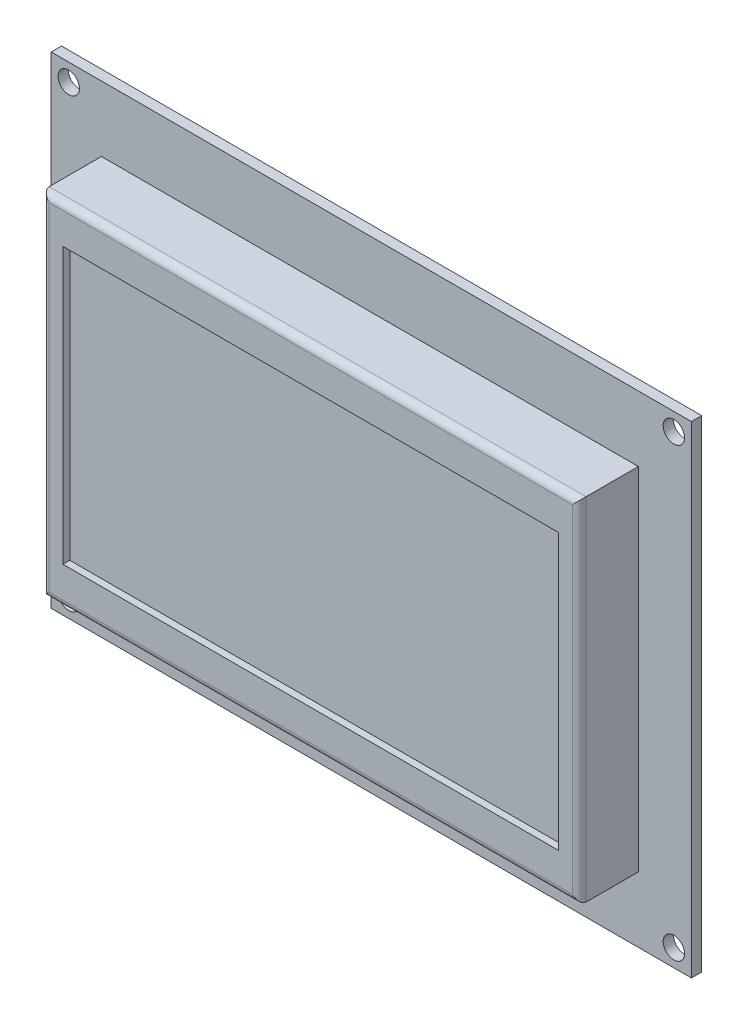
ISO-10303-21;
HEADER;
FILE_DESCRIPTION(('STEP AP214'),'2;1');
FILE_NAME('part.step','',(''),(''),'','','');
FILE_SCHEMA(('AUTOMOTIVE_DESIGN { 1 0 10303 214 1 1 1 1 }'));
ENDSEC;
DATA;
#1=APPLICATION_CONTEXT('core data for automotive mechanical design processes');
#2=APPLICATION_PROTOCOL_DEFINITION('international standard','automotive_design',2000,#1);
#3=PRODUCT_CONTEXT('',#1,'mechanical');
#4=PRODUCT('Part','Part','',(#3));
#5=PRODUCT_RELATED_PRODUCT_CATEGORY('part','',(#4));
#6=PRODUCT_DEFINITION_FORMATION('','',#4);
#7=PRODUCT_DEFINITION_CONTEXT('part definition',#1,'design');
#8=PRODUCT_DEFINITION('design','',#6,#7);
#9=PRODUCT_DEFINITION_SHAPE('','',#8);
#10=(LENGTH_UNIT() NAMED_UNIT(*) SI_UNIT(.MILLI.,.METRE.));
#11=(NAMED_UNIT(*) PLANE_ANGLE_UNIT() SI_UNIT($,.RADIAN.));
#12=(NAMED_UNIT(*) SI_UNIT($,.STERADIAN.) SOLID_ANGLE_UNIT());
#13=UNCERTAINTY_MEASURE_WITH_UNIT(LENGTH_MEASURE(1.E-05),#10,'distance_accuracy_value','');
#14=(GEOMETRIC_REPRESENTATION_CONTEXT(3) GLOBAL_UNCERTAINTY_ASSIGNED_CONTEXT((#13)) GLOBAL_UNIT_ASSIGNED_CONTEXT((#10,
#11,#12)) REPRESENTATION_CONTEXT('',''));
#15=CARTESIAN_POINT('',(0.,0.,0.));
#16=DIRECTION('',(0.,0.,1.));
#17=DIRECTION('',(1.,0.,0.));
#18=AXIS2_PLACEMENT_3D('',#15,#16,#17);
#19=CARTESIAN_POINT('',(-46.5,-26.5,4.5));
#20=DIRECTION('',(0.,-1.,0.));
#21=DIRECTION('',(1.,0.,0.));
#22=AXIS2_PLACEMENT_3D('',#19,#20,#21);
#23=PLANE('',#22);
#24=DIRECTION('',(1.,0.,0.));
#25=VECTOR('',#24,1.);
#26=CARTESIAN_POINT('',(-46.5,-26.5,6.));
#27=LINE('',#26,#25);
#28=CARTESIAN_POINT('',(-46.5,-26.5,6.));
#29=VERTEX_POINT('',#28);
#30=CARTESIAN_POINT('',(46.5,-26.5,6.));
#31=VERTEX_POINT('',#30);
#32=EDGE_CURVE('E217',#29,#31,#27,.T.);
#33=ORIENTED_EDGE('',*,*,#32,.F.);
#34=DIRECTION('',(0.,0.,1.));
#35=VECTOR('',#34,1.);
#36=CARTESIAN_POINT('',(-46.5,-26.5,4.5));
#37=LINE('',#36,#35);
#38=CARTESIAN_POINT('',(-46.5,-26.5,4.5));
#39=VERTEX_POINT('',#38);
#40=EDGE_CURVE('E242',#39,#29,#37,.T.);
#41=ORIENTED_EDGE('',*,*,#40,.F.);
#42=DIRECTION('',(1.,0.,0.));
#43=VECTOR('',#42,1.);
#44=CARTESIAN_POINT('',(-46.5,-26.5,4.5));
#45=LINE('',#44,#43);
#46=CARTESIAN_POINT('',(46.5,-26.5,4.5));
#47=VERTEX_POINT('',#46);
#48=EDGE_CURVE('E218',#39,#47,#45,.T.);
#49=ORIENTED_EDGE('',*,*,#48,.T.);
#50=DIRECTION('',(0.,0.,1.));
#51=VECTOR('',#50,1.);
#52=CARTESIAN_POINT('',(46.5,-26.5,4.5));
#53=LINE('',#52,#51);
#54=EDGE_CURVE('E231',#47,#31,#53,.T.);
#55=ORIENTED_EDGE('',*,*,#54,.T.);
#56=EDGE_LOOP('',(#33,#41,#49,#55));
#57=FACE_BOUND('',#56,.T.);
#58=ADVANCED_FACE('F36',(#57),#23,.T.);
#59=CARTESIAN_POINT('',(-46.5,43.5,4.5));
#60=DIRECTION('',(-1.,0.,0.));
#61=DIRECTION('',(0.,0.,1.));
#62=AXIS2_PLACEMENT_3D('',#59,#60,#61);
#63=PLANE('',#62);
#64=DIRECTION('',(0.,-1.,0.));
#65=VECTOR('',#64,1.);
#66=CARTESIAN_POINT('',(-46.5,43.5,6.));
#67=LINE('',#66,#65);
#68=CARTESIAN_POINT('',(-46.5,43.5,6.));
#69=VERTEX_POINT('',#68);
#70=EDGE_CURVE('E222',#69,#29,#67,.T.);
#71=ORIENTED_EDGE('',*,*,#70,.F.);
#72=DIRECTION('',(0.,0.,1.));
#73=VECTOR('',#72,1.);
#74=CARTESIAN_POINT('',(-46.5,43.5,4.5));
#75=LINE('',#74,#73);
#76=CARTESIAN_POINT('',(-46.5,43.5,4.5));
#77=VERTEX_POINT('',#76);
#78=EDGE_CURVE('E245',#77,#69,#75,.T.);
#79=ORIENTED_EDGE('',*,*,#78,.F.);
#80=DIRECTION('',(0.,-1.,0.));
#81=VECTOR('',#80,1.);
#82=CARTESIAN_POINT('',(-46.5,43.5,4.5));
#83=LINE('',#82,#81);
#84=EDGE_CURVE('E228',#77,#39,#83,.T.);
#85=ORIENTED_EDGE('',*,*,#84,.T.);
#86=ORIENTED_EDGE('',*,*,#40,.T.);
#87=EDGE_LOOP('',(#71,#79,#85,#86));
#88=FACE_BOUND('',#87,.T.);
#89=ADVANCED_FACE('F314',(#88),#63,.T.);
#90=CARTESIAN_POINT('',(46.5,43.5,4.5));
#91=DIRECTION('',(0.,1.,0.));
#92=DIRECTION('',(-1.,0.,0.));
#93=AXIS2_PLACEMENT_3D('',#90,#91,#92);
#94=PLANE('',#93);
#95=DIRECTION('',(-1.,0.,0.));
#96=VECTOR('',#95,1.);
#97=CARTESIAN_POINT('',(46.5,43.5,6.));
#98=LINE('',#97,#96);
#99=CARTESIAN_POINT('',(46.5,43.5,6.));
#100=VERTEX_POINT('',#99);
#101=EDGE_CURVE('E237',#100,#69,#98,.T.);
#102=ORIENTED_EDGE('',*,*,#101,.F.);
#103=DIRECTION('',(0.,0.,1.));
#104=VECTOR('',#103,1.);
#105=CARTESIAN_POINT('',(46.5,43.5,4.5));
#106=LINE('',#105,#104);
#107=CARTESIAN_POINT('',(46.5,43.5,4.5));
#108=VERTEX_POINT('',#107);
#109=EDGE_CURVE('E247',#108,#100,#106,.T.);
#110=ORIENTED_EDGE('',*,*,#109,.F.);
#111=DIRECTION('',(-1.,0.,0.));
#112=VECTOR('',#111,1.);
#113=CARTESIAN_POINT('',(46.5,43.5,4.5));
#114=LINE('',#113,#112);
#115=EDGE_CURVE('E225',#108,#77,#114,.T.);
#116=ORIENTED_EDGE('',*,*,#115,.T.);
#117=ORIENTED_EDGE('',*,*,#78,.T.);
#118=EDGE_LOOP('',(#102,#110,#116,#117));
#119=FACE_BOUND('',#118,.T.);
#120=ADVANCED_FACE('F320',(#119),#94,.T.);
#121=CARTESIAN_POINT('',(46.5,-26.5,4.5));
#122=DIRECTION('',(1.,0.,0.));
#123=DIRECTION('',(0.,0.,-1.));
#124=AXIS2_PLACEMENT_3D('',#121,#122,#123);
#125=PLANE('',#124);
#126=DIRECTION('',(0.,1.,0.));
#127=VECTOR('',#126,1.);
#128=CARTESIAN_POINT('',(46.5,-26.5,6.));
#129=LINE('',#128,#127);
#130=EDGE_CURVE('E234',#31,#100,#129,.T.);
#131=ORIENTED_EDGE('',*,*,#130,.F.);
#132=ORIENTED_EDGE('',*,*,#54,.F.);
#133=DIRECTION('',(0.,1.,0.));
#134=VECTOR('',#133,1.);
#135=CARTESIAN_POINT('',(46.5,-26.5,4.5));
#136=LINE('',#135,#134);
#137=EDGE_CURVE('E221',#47,#108,#136,.T.);
#138=ORIENTED_EDGE('',*,*,#137,.T.);
#139=ORIENTED_EDGE('',*,*,#109,.T.);
#140=EDGE_LOOP('',(#131,#132,#138,#139));
#141=FACE_BOUND('',#140,.T.);
#142=ADVANCED_FACE('F326',(#141),#125,.T.);
#143=CARTESIAN_POINT('',(0.,0.,4.5));
#144=DIRECTION('',(0.,0.,1.));
#145=DIRECTION('',(1.,0.,0.));
#146=AXIS2_PLACEMENT_3D('',#143,#144,#145);
#147=PLANE('',#146);
#148=CARTESIAN_POINT('',(-43.95,-23.95,4.5));
#149=DIRECTION('',(0.,0.,-1.));
#150=DIRECTION('',(-1.,0.,0.));
#151=AXIS2_PLACEMENT_3D('',#148,#149,#150);
#152=CIRCLE('',#151,1.54999999999999);
#153=CARTESIAN_POINT('',(-45.5,-23.95,4.5));
#154=VERTEX_POINT('',#153);
#155=EDGE_CURVE('E177',#154,#154,#152,.T.);
#156=ORIENTED_EDGE('',*,*,#155,.F.);
#157=EDGE_LOOP('',(#156));
#158=FACE_BOUND('',#157,.T.);
#159=CARTESIAN_POINT('',(43.95,-23.95,4.5));
#160=DIRECTION('',(0.,0.,-1.));
#161=DIRECTION('',(-1.,0.,0.));
#162=AXIS2_PLACEMENT_3D('',#159,#160,#161);
#163=CIRCLE('',#162,1.54999999999999);
#164=CARTESIAN_POINT('',(42.4,-23.95,4.5));
#165=VERTEX_POINT('',#164);
#166=EDGE_CURVE('E183',#165,#165,#163,.T.);
#167=ORIENTED_EDGE('',*,*,#166,.F.);
#168=EDGE_LOOP('',(#167));
#169=FACE_BOUND('',#168,.T.);
#170=CARTESIAN_POINT('',(-43.95,40.95,4.5));
#171=DIRECTION('',(0.,0.,-1.));
#172=DIRECTION('',(-1.,0.,0.));
#173=AXIS2_PLACEMENT_3D('',#170,#171,#172);
#174=CIRCLE('',#173,1.54999999999999);
#175=CARTESIAN_POINT('',(-45.5,40.95,4.5));
#176=VERTEX_POINT('',#175);
#177=EDGE_CURVE('E189',#176,#176,#174,.T.);
#178=ORIENTED_EDGE('',*,*,#177,.F.);
#179=EDGE_LOOP('',(#178));
#180=FACE_BOUND('',#179,.T.);
#181=CARTESIAN_POINT('',(43.95,40.95,4.5));
#182=DIRECTION('',(0.,0.,-1.));
#183=DIRECTION('',(-1.,0.,0.));
#184=AXIS2_PLACEMENT_3D('',#181,#182,#183);
#185=CIRCLE('',#184,1.54999999999999);
#186=CARTESIAN_POINT('',(42.4,40.95,4.5));
#187=VERTEX_POINT('',#186);
#188=EDGE_CURVE('E193',#187,#187,#185,.T.);
#189=ORIENTED_EDGE('',*,*,#188,.F.);
#190=EDGE_LOOP('',(#189));
#191=FACE_BOUND('',#190,.T.);
#192=ORIENTED_EDGE('',*,*,#48,.F.);
#193=ORIENTED_EDGE('',*,*,#84,.F.);
#194=ORIENTED_EDGE('',*,*,#115,.F.);
#195=ORIENTED_EDGE('',*,*,#137,.F.);
#196=EDGE_LOOP('',(#192,#193,#194,#195));
#197=FACE_BOUND('',#196,.T.);
#198=ADVANCED_FACE('F359',(#158,#169,#180,#191,#197),#147,.F.);
#199=CARTESIAN_POINT('',(0.,0.,6.));
#200=DIRECTION('',(0.,0.,1.));
#201=DIRECTION('',(1.,0.,0.));
#202=AXIS2_PLACEMENT_3D('',#199,#200,#201);
#203=PLANE('',#202);
#204=CARTESIAN_POINT('',(-43.95,-23.95,6.));
#205=DIRECTION('',(0.,0.,1.));
#206=DIRECTION('',(1.,0.,0.));
#207=AXIS2_PLACEMENT_3D('',#204,#205,#206);
#208=CIRCLE('',#207,1.54999999999999);
#209=CARTESIAN_POINT('',(-42.4,-23.95,6.));
#210=VERTEX_POINT('',#209);
#211=EDGE_CURVE('E180',#210,#210,#208,.T.);
#212=ORIENTED_EDGE('',*,*,#211,.F.);
#213=EDGE_LOOP('',(#212));
#214=FACE_BOUND('',#213,.T.);
#215=CARTESIAN_POINT('',(43.95,-23.95,6.));
#216=DIRECTION('',(0.,0.,1.));
#217=DIRECTION('',(1.,0.,0.));
#218=AXIS2_PLACEMENT_3D('',#215,#216,#217);
#219=CIRCLE('',#218,1.54999999999999);
#220=CARTESIAN_POINT('',(45.5,-23.95,6.));
#221=VERTEX_POINT('',#220);
#222=EDGE_CURVE('E186',#221,#221,#219,.T.);
#223=ORIENTED_EDGE('',*,*,#222,.F.);
#224=EDGE_LOOP('',(#223));
#225=FACE_BOUND('',#224,.T.);
#226=CARTESIAN_POINT('',(-43.95,40.95,6.));
#227=DIRECTION('',(0.,0.,1.));
#228=DIRECTION('',(1.,0.,0.));
#229=AXIS2_PLACEMENT_3D('',#226,#227,#228);
#230=CIRCLE('',#229,1.54999999999999);
#231=CARTESIAN_POINT('',(-42.4,40.95,6.));
#232=VERTEX_POINT('',#231);
#233=EDGE_CURVE('E192',#232,#232,#230,.T.);
#234=ORIENTED_EDGE('',*,*,#233,.F.);
#235=EDGE_LOOP('',(#234));
#236=FACE_BOUND('',#235,.T.);
#237=CARTESIAN_POINT('',(43.95,40.95,6.));
#238=DIRECTION('',(0.,0.,1.));
#239=DIRECTION('',(1.,0.,0.));
#240=AXIS2_PLACEMENT_3D('',#237,#238,#239);
#241=CIRCLE('',#240,1.54999999999999);
#242=CARTESIAN_POINT('',(45.5,40.95,6.));
#243=VERTEX_POINT('',#242);
#244=EDGE_CURVE('E196',#243,#243,#241,.T.);
#245=ORIENTED_EDGE('',*,*,#244,.F.);
#246=EDGE_LOOP('',(#245));
#247=FACE_BOUND('',#246,.T.);
#248=DIRECTION('',(1.,0.,0.));
#249=VECTOR('',#248,1.);
#250=CARTESIAN_POINT('',(38.8,-17.,6.));
#251=LINE('',#250,#249);
#252=CARTESIAN_POINT('',(-39.2,-17.,6.));
#253=VERTEX_POINT('',#252);
#254=CARTESIAN_POINT('',(38.8,-17.,6.));
#255=VERTEX_POINT('',#254);
#256=EDGE_CURVE('E197',#253,#255,#251,.T.);
#257=ORIENTED_EDGE('',*,*,#256,.F.);
#258=DIRECTION('',(0.,-1.,0.));
#259=VECTOR('',#258,1.);
#260=CARTESIAN_POINT('',(-39.2,-17.,6.));
#261=LINE('',#260,#259);
#262=CARTESIAN_POINT('',(-39.2,34.,6.));
#263=VERTEX_POINT('',#262);
#264=EDGE_CURVE('E206',#263,#253,#261,.T.);
#265=ORIENTED_EDGE('',*,*,#264,.F.);
#266=DIRECTION('',(-1.,0.,0.));
#267=VECTOR('',#266,1.);
#268=CARTESIAN_POINT('',(-39.2,34.,6.));
#269=LINE('',#268,#267);
#270=CARTESIAN_POINT('',(38.8,34.,6.));
#271=VERTEX_POINT('',#270);
#272=EDGE_CURVE('E203',#271,#263,#269,.T.);
#273=ORIENTED_EDGE('',*,*,#272,.F.);
#274=DIRECTION('',(0.,1.,0.));
#275=VECTOR('',#274,1.);
#276=CARTESIAN_POINT('',(38.8,34.,6.));
#277=LINE('',#276,#275);
#278=EDGE_CURVE('E200',#255,#271,#277,.T.);
#279=ORIENTED_EDGE('',*,*,#278,.F.);
#280=EDGE_LOOP('',(#257,#265,#273,#279));
#281=FACE_BOUND('',#280,.T.);
#282=ORIENTED_EDGE('',*,*,#32,.T.);
#283=ORIENTED_EDGE('',*,*,#130,.T.);
#284=ORIENTED_EDGE('',*,*,#101,.T.);
#285=ORIENTED_EDGE('',*,*,#70,.T.);
#286=EDGE_LOOP('',(#282,#283,#284,#285));
#287=FACE_BOUND('',#286,.T.);
#288=ADVANCED_FACE('F362',(#214,#225,#236,#247,#281,#287),#203,.T.);
#289=CARTESIAN_POINT('',(38.8,-17.,14.6));
#290=DIRECTION('',(0.,1.,0.));
#291=DIRECTION('',(0.,0.,1.));
#292=AXIS2_PLACEMENT_3D('',#289,#290,#291);
#293=PLANE('',#292);
#294=DIRECTION('',(0.,0.,-1.));
#295=VECTOR('',#294,1.);
#296=CARTESIAN_POINT('',(38.8,-17.,14.6));
#297=LINE('',#296,#295);
#298=CARTESIAN_POINT('',(38.8,-17.,13.6));
#299=VERTEX_POINT('',#298);
#300=EDGE_CURVE('E215',#299,#255,#297,.T.);
#301=ORIENTED_EDGE('',*,*,#300,.F.);
#302=DIRECTION('',(1.,0.,0.));
#303=VECTOR('',#302,1.);
#304=CARTESIAN_POINT('',(38.8,-17.,13.6));
#305=LINE('',#304,#303);
#306=CARTESIAN_POINT('',(-39.2,-17.,13.6));
#307=VERTEX_POINT('',#306);
#308=EDGE_CURVE('E11',#299,#307,#305,.F.);
#309=ORIENTED_EDGE('',*,*,#308,.T.);
#310=DIRECTION('',(0.,0.,-1.));
#311=VECTOR('',#310,1.);
#312=CARTESIAN_POINT('',(-39.2,-17.,14.6));
#313=LINE('',#312,#311);
#314=EDGE_CURVE('E209',#307,#253,#313,.T.);
#315=ORIENTED_EDGE('',*,*,#314,.T.);
#316=ORIENTED_EDGE('',*,*,#256,.T.);
#317=EDGE_LOOP('',(#301,#309,#315,#316));
#318=FACE_BOUND('',#317,.T.);
#319=ADVANCED_FACE('F378',(#318),#293,.F.);
#320=CARTESIAN_POINT('',(38.8,34.,14.6));
#321=DIRECTION('',(-1.,0.,0.));
#322=DIRECTION('',(0.,-1.,0.));
#323=AXIS2_PLACEMENT_3D('',#320,#321,#322);
#324=PLANE('',#323);
#325=DIRECTION('',(0.,0.,-1.));
#326=VECTOR('',#325,1.);
#327=CARTESIAN_POINT('',(38.8,34.,14.6));
#328=LINE('',#327,#326);
#329=CARTESIAN_POINT('',(38.8,34.,13.6));
#330=VERTEX_POINT('',#329);
#331=EDGE_CURVE('E213',#330,#271,#328,.T.);
#332=ORIENTED_EDGE('',*,*,#331,.F.);
#333=DIRECTION('',(0.,1.,0.));
#334=VECTOR('',#333,1.);
#335=CARTESIAN_POINT('',(38.8,34.,13.6));
#336=LINE('',#335,#334);
#337=EDGE_CURVE('E265',#330,#299,#336,.F.);
#338=ORIENTED_EDGE('',*,*,#337,.T.);
#339=ORIENTED_EDGE('',*,*,#300,.T.);
#340=ORIENTED_EDGE('',*,*,#278,.T.);
#341=EDGE_LOOP('',(#332,#338,#339,#340));
#342=FACE_BOUND('',#341,.T.);
#343=ADVANCED_FACE('F384',(#342),#324,.F.);
#344=CARTESIAN_POINT('',(-39.2,34.,14.6));
#345=DIRECTION('',(0.,-1.,0.));
#346=DIRECTION('',(0.,0.,-1.));
#347=AXIS2_PLACEMENT_3D('',#344,#345,#346);
#348=PLANE('',#347);
#349=DIRECTION('',(0.,0.,-1.));
#350=VECTOR('',#349,1.);
#351=CARTESIAN_POINT('',(-39.2,34.,14.6));
#352=LINE('',#351,#350);
#353=CARTESIAN_POINT('',(-39.2,34.,13.6));
#354=VERTEX_POINT('',#353);
#355=EDGE_CURVE('E211',#354,#263,#352,.T.);
#356=ORIENTED_EDGE('',*,*,#355,.F.);
#357=DIRECTION('',(-1.,0.,0.));
#358=VECTOR('',#357,1.);
#359=CARTESIAN_POINT('',(-39.2,34.,13.6));
#360=LINE('',#359,#358);
#361=EDGE_CURVE('E262',#354,#330,#360,.F.);
#362=ORIENTED_EDGE('',*,*,#361,.T.);
#363=ORIENTED_EDGE('',*,*,#331,.T.);
#364=ORIENTED_EDGE('',*,*,#272,.T.);
#365=EDGE_LOOP('',(#356,#362,#363,#364));
#366=FACE_BOUND('',#365,.T.);
#367=ADVANCED_FACE('F293',(#366),#348,.F.);
#368=CARTESIAN_POINT('',(-39.2,-17.,14.6));
#369=DIRECTION('',(1.,0.,0.));
#370=DIRECTION('',(0.,0.,-1.));
#371=AXIS2_PLACEMENT_3D('',#368,#369,#370);
#372=PLANE('',#371);
#373=ORIENTED_EDGE('',*,*,#314,.F.);
#374=DIRECTION('',(0.,-1.,0.));
#375=VECTOR('',#374,1.);
#376=CARTESIAN_POINT('',(-39.2,-17.,13.6));
#377=LINE('',#376,#375);
#378=EDGE_CURVE('E45',#307,#354,#377,.F.);
#379=ORIENTED_EDGE('',*,*,#378,.T.);
#380=ORIENTED_EDGE('',*,*,#355,.T.);
#381=ORIENTED_EDGE('',*,*,#264,.T.);
#382=EDGE_LOOP('',(#373,#379,#380,#381));
#383=FACE_BOUND('',#382,.T.);
#384=ADVANCED_FACE('F289',(#383),#372,.F.);
#385=CARTESIAN_POINT('',(0.,0.,14.6));
#386=DIRECTION('',(0.,0.,-1.));
#387=DIRECTION('',(-1.,0.,0.));
#388=AXIS2_PLACEMENT_3D('',#385,#386,#387);
#389=PLANE('',#388);
#390=DIRECTION('',(1.,0.,0.));
#391=VECTOR('',#390,1.);
#392=CARTESIAN_POINT('',(-36.2,-11.5,14.6));
#393=LINE('',#392,#391);
#394=CARTESIAN_POINT('',(-36.2,-11.5,14.6));
#395=VERTEX_POINT('',#394);
#396=CARTESIAN_POINT('',(35.8,-11.5,14.6));
#397=VERTEX_POINT('',#396);
#398=EDGE_CURVE('E167',#395,#397,#393,.T.);
#399=ORIENTED_EDGE('',*,*,#398,.F.);
#400=DIRECTION('',(0.,-1.,0.));
#401=VECTOR('',#400,1.);
#402=CARTESIAN_POINT('',(-36.2,-11.5,14.6));
#403=LINE('',#402,#401);
#404=CARTESIAN_POINT('',(-36.2,28.5,14.6));
#405=VERTEX_POINT('',#404);
#406=EDGE_CURVE('E53',#405,#395,#403,.T.);
#407=ORIENTED_EDGE('',*,*,#406,.F.);
#408=DIRECTION('',(-1.,0.,0.));
#409=VECTOR('',#408,1.);
#410=CARTESIAN_POINT('',(-36.2,28.5,14.6));
#411=LINE('',#410,#409);
#412=CARTESIAN_POINT('',(35.8,28.5,14.6));
#413=VERTEX_POINT('',#412);
#414=EDGE_CURVE('E158',#413,#405,#411,.T.);
#415=ORIENTED_EDGE('',*,*,#414,.F.);
#416=DIRECTION('',(0.,1.,0.));
#417=VECTOR('',#416,1.);
#418=CARTESIAN_POINT('',(35.8,-11.5,14.6));
#419=LINE('',#418,#417);
#420=EDGE_CURVE('E161',#397,#413,#419,.T.);
#421=ORIENTED_EDGE('',*,*,#420,.F.);
#422=EDGE_LOOP('',(#399,#407,#415,#421));
#423=FACE_BOUND('',#422,.T.);
#424=DIRECTION('',(0.,1.,0.));
#425=VECTOR('',#424,1.);
#426=CARTESIAN_POINT('',(37.8,0.,14.6));
#427=LINE('',#426,#425);
#428=CARTESIAN_POINT('',(37.8,-16.,14.6));
#429=VERTEX_POINT('',#428);
#430=CARTESIAN_POINT('',(37.8,33.,14.6));
#431=VERTEX_POINT('',#430);
#432=EDGE_CURVE('E257',#429,#431,#427,.T.);
#433=ORIENTED_EDGE('',*,*,#432,.T.);
#434=DIRECTION('',(-1.,0.,0.));
#435=VECTOR('',#434,1.);
#436=CARTESIAN_POINT('',(0.,33.,14.6));
#437=LINE('',#436,#435);
#438=CARTESIAN_POINT('',(-38.2,33.,14.6));
#439=VERTEX_POINT('',#438);
#440=EDGE_CURVE('E259',#431,#439,#437,.T.);
#441=ORIENTED_EDGE('',*,*,#440,.T.);
#442=DIRECTION('',(0.,-1.,0.));
#443=VECTOR('',#442,1.);
#444=CARTESIAN_POINT('',(-38.2,0.,14.6));
#445=LINE('',#444,#443);
#446=CARTESIAN_POINT('',(-38.2,-16.,14.6));
#447=VERTEX_POINT('',#446);
#448=EDGE_CURVE('E255',#439,#447,#445,.T.);
#449=ORIENTED_EDGE('',*,*,#448,.T.);
#450=DIRECTION('',(1.,0.,0.));
#451=VECTOR('',#450,1.);
#452=CARTESIAN_POINT('',(0.,-16.,14.6));
#453=LINE('',#452,#451);
#454=EDGE_CURVE('E244',#447,#429,#453,.T.);
#455=ORIENTED_EDGE('',*,*,#454,.T.);
#456=EDGE_LOOP('',(#433,#441,#449,#455));
#457=FACE_BOUND('',#456,.T.);
#458=ADVANCED_FACE('F300',(#423,#457),#389,.F.);
#459=CARTESIAN_POINT('',(43.95,40.95,4.5));
#460=DIRECTION('',(0.,0.,-1.));
#461=DIRECTION('',(-1.,0.,0.));
#462=AXIS2_PLACEMENT_3D('',#459,#460,#461);
#463=CYLINDRICAL_SURFACE('',#462,1.54999999999999);
#464=ORIENTED_EDGE('',*,*,#244,.T.);
#465=EDGE_LOOP('',(#464));
#466=FACE_BOUND('',#465,.T.);
#467=ORIENTED_EDGE('',*,*,#188,.T.);
#468=EDGE_LOOP('',(#467));
#469=FACE_BOUND('',#468,.T.);
#470=ADVANCED_FACE('F302',(#466,#469),#463,.F.);
#471=CARTESIAN_POINT('',(-43.95,40.95,4.5));
#472=DIRECTION('',(0.,0.,-1.));
#473=DIRECTION('',(-1.,0.,0.));
#474=AXIS2_PLACEMENT_3D('',#471,#472,#473);
#475=CYLINDRICAL_SURFACE('',#474,1.54999999999999);
#476=ORIENTED_EDGE('',*,*,#233,.T.);
#477=EDGE_LOOP('',(#476));
#478=FACE_BOUND('',#477,.T.);
#479=ORIENTED_EDGE('',*,*,#177,.T.);
#480=EDGE_LOOP('',(#479));
#481=FACE_BOUND('',#480,.T.);
#482=ADVANCED_FACE('F309',(#478,#481),#475,.F.);
#483=CARTESIAN_POINT('',(43.95,-23.95,4.5));
#484=DIRECTION('',(0.,0.,-1.));
#485=DIRECTION('',(-1.,0.,0.));
#486=AXIS2_PLACEMENT_3D('',#483,#484,#485);
#487=CYLINDRICAL_SURFACE('',#486,1.54999999999999);
#488=ORIENTED_EDGE('',*,*,#222,.T.);
#489=EDGE_LOOP('',(#488));
#490=FACE_BOUND('',#489,.T.);
#491=ORIENTED_EDGE('',*,*,#166,.T.);
#492=EDGE_LOOP('',(#491));
#493=FACE_BOUND('',#492,.T.);
#494=ADVANCED_FACE('F339',(#490,#493),#487,.F.);
#495=CARTESIAN_POINT('',(-43.95,-23.95,4.5));
#496=DIRECTION('',(0.,0.,-1.));
#497=DIRECTION('',(-1.,0.,0.));
#498=AXIS2_PLACEMENT_3D('',#495,#496,#497);
#499=CYLINDRICAL_SURFACE('',#498,1.54999999999999);
#500=ORIENTED_EDGE('',*,*,#211,.T.);
#501=EDGE_LOOP('',(#500));
#502=FACE_BOUND('',#501,.T.);
#503=ORIENTED_EDGE('',*,*,#155,.T.);
#504=EDGE_LOOP('',(#503));
#505=FACE_BOUND('',#504,.T.);
#506=ADVANCED_FACE('F335',(#502,#505),#499,.F.);
#507=CARTESIAN_POINT('',(0.,-16.,13.6));
#508=DIRECTION('',(1.,0.,0.));
#509=DIRECTION('',(0.,0.,-1.));
#510=AXIS2_PLACEMENT_3D('',#507,#508,#509);
#511=CYLINDRICAL_SURFACE('',#510,0.999999999999999);
#512=CARTESIAN_POINT('',(-38.2,-16.,13.6));
#513=DIRECTION('',(0.707106781186547,-0.707106781186547,0.));
#514=DIRECTION('',(0.707106781186547,0.707106781186547,0.));
#515=AXIS2_PLACEMENT_3D('',#512,#513,#514);
#516=ELLIPSE('',#515,1.41421356237309,0.999999999999999);
#517=EDGE_CURVE('E270',#307,#447,#516,.F.);
#518=ORIENTED_EDGE('',*,*,#517,.F.);
#519=ORIENTED_EDGE('',*,*,#308,.F.);
#520=CARTESIAN_POINT('',(37.8,-16.,13.6));
#521=DIRECTION('',(0.707106781186547,0.707106781186548,0.));
#522=DIRECTION('',(0.707106781186548,-0.707106781186547,0.));
#523=AXIS2_PLACEMENT_3D('',#520,#521,#522);
#524=ELLIPSE('',#523,1.41421356237309,0.999999999999999);
#525=EDGE_CURVE('E40',#429,#299,#524,.T.);
#526=ORIENTED_EDGE('',*,*,#525,.F.);
#527=ORIENTED_EDGE('',*,*,#454,.F.);
#528=EDGE_LOOP('',(#518,#519,#526,#527));
#529=FACE_BOUND('',#528,.T.);
#530=ADVANCED_FACE('F38',(#529),#511,.T.);
#531=CARTESIAN_POINT('',(37.8,0.,13.6));
#532=DIRECTION('',(0.,1.,0.));
#533=DIRECTION('',(-1.,0.,0.));
#534=AXIS2_PLACEMENT_3D('',#531,#532,#533);
#535=CYLINDRICAL_SURFACE('',#534,0.999999999999999);
#536=ORIENTED_EDGE('',*,*,#525,.T.);
#537=ORIENTED_EDGE('',*,*,#337,.F.);
#538=CARTESIAN_POINT('',(37.8,33.,13.6));
#539=DIRECTION('',(-0.707106781186548,0.707106781186547,0.));
#540=DIRECTION('',(0.707106781186547,0.707106781186548,0.));
#541=AXIS2_PLACEMENT_3D('',#538,#539,#540);
#542=ELLIPSE('',#541,1.41421356237309,0.999999999999999);
#543=EDGE_CURVE('E269',#431,#330,#542,.T.);
#544=ORIENTED_EDGE('',*,*,#543,.F.);
#545=ORIENTED_EDGE('',*,*,#432,.F.);
#546=EDGE_LOOP('',(#536,#537,#544,#545));
#547=FACE_BOUND('',#546,.T.);
#548=ADVANCED_FACE('F281',(#547),#535,.T.);
#549=CARTESIAN_POINT('',(-38.2,0.,13.6));
#550=DIRECTION('',(0.,-1.,0.));
#551=DIRECTION('',(0.,0.,-1.));
#552=AXIS2_PLACEMENT_3D('',#549,#550,#551);
#553=CYLINDRICAL_SURFACE('',#552,0.999999999999999);
#554=ORIENTED_EDGE('',*,*,#517,.T.);
#555=ORIENTED_EDGE('',*,*,#448,.F.);
#556=CARTESIAN_POINT('',(-38.2,33.,13.6));
#557=DIRECTION('',(-0.707106781186547,-0.707106781186547,0.));
#558=DIRECTION('',(0.707106781186547,-0.707106781186547,0.));
#559=AXIS2_PLACEMENT_3D('',#556,#557,#558);
#560=ELLIPSE('',#559,1.41421356237309,0.999999999999999);
#561=EDGE_CURVE('E173',#354,#439,#560,.F.);
#562=ORIENTED_EDGE('',*,*,#561,.F.);
#563=ORIENTED_EDGE('',*,*,#378,.F.);
#564=EDGE_LOOP('',(#554,#555,#562,#563));
#565=FACE_BOUND('',#564,.T.);
#566=ADVANCED_FACE('F286',(#565),#553,.T.);
#567=CARTESIAN_POINT('',(0.,33.,13.6));
#568=DIRECTION('',(-1.,0.,0.));
#569=DIRECTION('',(0.,0.,1.));
#570=AXIS2_PLACEMENT_3D('',#567,#568,#569);
#571=CYLINDRICAL_SURFACE('',#570,0.999999999999999);
#572=ORIENTED_EDGE('',*,*,#543,.T.);
#573=ORIENTED_EDGE('',*,*,#361,.F.);
#574=ORIENTED_EDGE('',*,*,#561,.T.);
#575=ORIENTED_EDGE('',*,*,#440,.F.);
#576=EDGE_LOOP('',(#572,#573,#574,#575));
#577=FACE_BOUND('',#576,.T.);
#578=ADVANCED_FACE('F297',(#577),#571,.T.);
#579=CARTESIAN_POINT('',(-36.2,-11.5,13.6));
#580=DIRECTION('',(-1.,0.,0.));
#581=DIRECTION('',(0.,0.,1.));
#582=AXIS2_PLACEMENT_3D('',#579,#580,#581);
#583=PLANE('',#582);
#584=ORIENTED_EDGE('',*,*,#406,.T.);
#585=DIRECTION('',(0.,0.,1.));
#586=VECTOR('',#585,1.);
#587=CARTESIAN_POINT('',(-36.2,-11.5,13.6));
#588=LINE('',#587,#586);
#589=CARTESIAN_POINT('',(-36.2,-11.5,13.6));
#590=VERTEX_POINT('',#589);
#591=EDGE_CURVE('E136',#590,#395,#588,.T.);
#592=ORIENTED_EDGE('',*,*,#591,.F.);
#593=DIRECTION('',(0.,-1.,0.));
#594=VECTOR('',#593,1.);
#595=CARTESIAN_POINT('',(-36.2,-11.5,13.6));
#596=LINE('',#595,#594);
#597=CARTESIAN_POINT('',(-36.2,28.5,13.6));
#598=VERTEX_POINT('',#597);
#599=EDGE_CURVE('E140',#598,#590,#596,.T.);
#600=ORIENTED_EDGE('',*,*,#599,.F.);
#601=DIRECTION('',(0.,0.,1.));
#602=VECTOR('',#601,1.);
#603=CARTESIAN_POINT('',(-36.2,28.5,13.6));
#604=LINE('',#603,#602);
#605=EDGE_CURVE('E171',#598,#405,#604,.T.);
#606=ORIENTED_EDGE('',*,*,#605,.T.);
#607=EDGE_LOOP('',(#584,#592,#600,#606));
#608=FACE_BOUND('',#607,.T.);
#609=ADVANCED_FACE('F138',(#608),#583,.F.);
#610=CARTESIAN_POINT('',(-36.2,28.5,13.6));
#611=DIRECTION('',(0.,1.,0.));
#612=DIRECTION('',(0.,0.,1.));
#613=AXIS2_PLACEMENT_3D('',#610,#611,#612);
#614=PLANE('',#613);
#615=ORIENTED_EDGE('',*,*,#414,.T.);
#616=ORIENTED_EDGE('',*,*,#605,.F.);
#617=DIRECTION('',(-1.,0.,0.));
#618=VECTOR('',#617,1.);
#619=CARTESIAN_POINT('',(-36.2,28.5,13.6));
#620=LINE('',#619,#618);
#621=CARTESIAN_POINT('',(35.8,28.5,13.6));
#622=VERTEX_POINT('',#621);
#623=EDGE_CURVE('E146',#622,#598,#620,.T.);
#624=ORIENTED_EDGE('',*,*,#623,.F.);
#625=DIRECTION('',(0.,0.,1.));
#626=VECTOR('',#625,1.);
#627=CARTESIAN_POINT('',(35.8,28.5,13.6));
#628=LINE('',#627,#626);
#629=EDGE_CURVE('E174',#622,#413,#628,.T.);
#630=ORIENTED_EDGE('',*,*,#629,.T.);
#631=EDGE_LOOP('',(#615,#616,#624,#630));
#632=FACE_BOUND('',#631,.T.);
#633=ADVANCED_FACE('F484',(#632),#614,.F.);
#634=CARTESIAN_POINT('',(35.8,-11.5,13.6));
#635=DIRECTION('',(1.,0.,0.));
#636=DIRECTION('',(0.,0.,-1.));
#637=AXIS2_PLACEMENT_3D('',#634,#635,#636);
#638=PLANE('',#637);
#639=ORIENTED_EDGE('',*,*,#420,.T.);
#640=ORIENTED_EDGE('',*,*,#629,.F.);
#641=DIRECTION('',(0.,1.,0.));
#642=VECTOR('',#641,1.);
#643=CARTESIAN_POINT('',(35.8,-11.5,13.6));
#644=LINE('',#643,#642);
#645=CARTESIAN_POINT('',(35.8,-11.5,13.6));
#646=VERTEX_POINT('',#645);
#647=EDGE_CURVE('E154',#646,#622,#644,.T.);
#648=ORIENTED_EDGE('',*,*,#647,.F.);
#649=DIRECTION('',(0.,0.,1.));
#650=VECTOR('',#649,1.);
#651=CARTESIAN_POINT('',(35.8,-11.5,13.6));
#652=LINE('',#651,#650);
#653=EDGE_CURVE('E145',#646,#397,#652,.T.);
#654=ORIENTED_EDGE('',*,*,#653,.T.);
#655=EDGE_LOOP('',(#639,#640,#648,#654));
#656=FACE_BOUND('',#655,.T.);
#657=ADVANCED_FACE('F492',(#656),#638,.F.);
#658=CARTESIAN_POINT('',(-36.2,-11.5,13.6));
#659=DIRECTION('',(0.,-1.,0.));
#660=DIRECTION('',(0.,0.,-1.));
#661=AXIS2_PLACEMENT_3D('',#658,#659,#660);
#662=PLANE('',#661);
#663=ORIENTED_EDGE('',*,*,#398,.T.);
#664=ORIENTED_EDGE('',*,*,#653,.F.);
#665=DIRECTION('',(1.,0.,0.));
#666=VECTOR('',#665,1.);
#667=CARTESIAN_POINT('',(-36.2,-11.5,13.6));
#668=LINE('',#667,#666);
#669=EDGE_CURVE('E149',#590,#646,#668,.T.);
#670=ORIENTED_EDGE('',*,*,#669,.F.);
#671=ORIENTED_EDGE('',*,*,#591,.T.);
#672=EDGE_LOOP('',(#663,#664,#670,#671));
#673=FACE_BOUND('',#672,.T.);
#674=ADVANCED_FACE('F150',(#673),#662,.F.);
#675=CARTESIAN_POINT('',(0.,0.,13.6));
#676=DIRECTION('',(0.,0.,-1.));
#677=DIRECTION('',(-1.,0.,0.));
#678=AXIS2_PLACEMENT_3D('',#675,#676,#677);
#679=PLANE('',#678);
#680=ORIENTED_EDGE('',*,*,#599,.T.);
#681=ORIENTED_EDGE('',*,*,#669,.T.);
#682=ORIENTED_EDGE('',*,*,#647,.T.);
#683=ORIENTED_EDGE('',*,*,#623,.T.);
#684=EDGE_LOOP('',(#680,#681,#682,#683));
#685=FACE_BOUND('',#684,.T.);
#686=ADVANCED_FACE('F156',(#685),#679,.F.);
#687=CLOSED_SHELL('',(#58,#89,#120,#142,#198,#288,#319,#343,#367,#384,#458,#470,#482,#494,#506,
#530,#548,#566,#578,#609,#633,#657,#674,#686));
#688=MANIFOLD_SOLID_BREP('B2',#687);
#689=ADVANCED_BREP_SHAPE_REPRESENTATION('',(#18,#688),#14);
#690=SHAPE_DEFINITION_REPRESENTATION(#9,#689);
ENDSEC;
END-ISO-10303-21;
